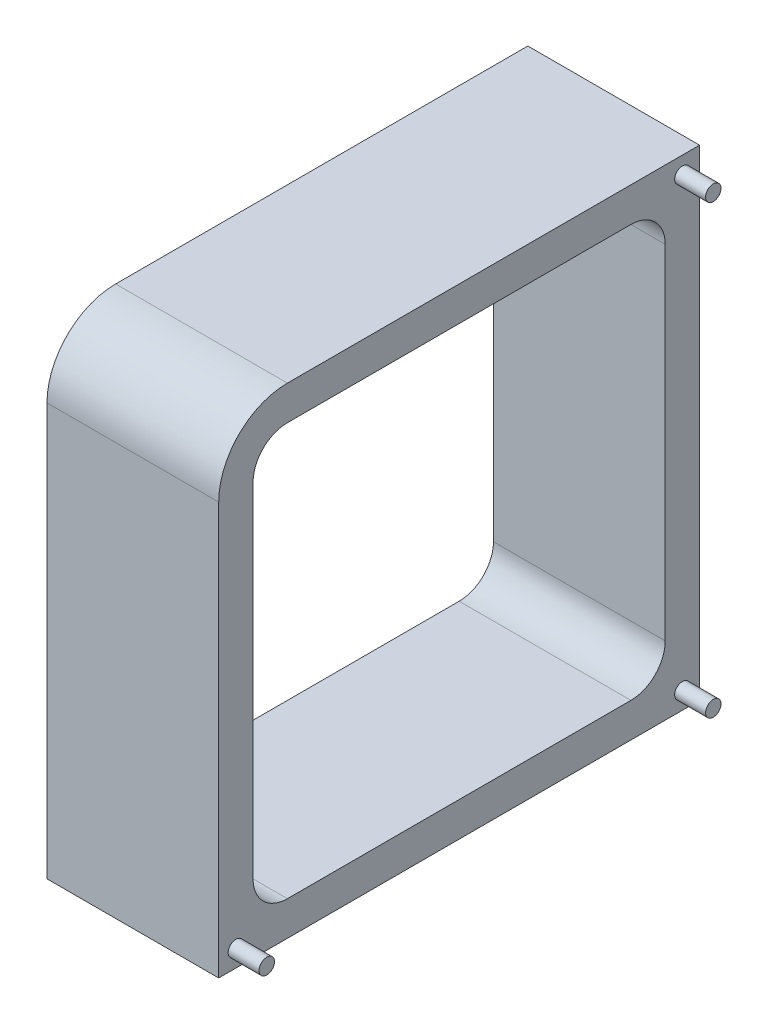
ISO-10303-21;
HEADER;
FILE_DESCRIPTION(('STEP AP214'),'2;1');
FILE_NAME('part.step','',(''),(''),'','','');
FILE_SCHEMA(('AUTOMOTIVE_DESIGN { 1 0 10303 214 1 1 1 1 }'));
ENDSEC;
DATA;
#1=APPLICATION_CONTEXT('core data for automotive mechanical design processes');
#2=APPLICATION_PROTOCOL_DEFINITION('international standard','automotive_design',2000,#1);
#3=PRODUCT_CONTEXT('',#1,'mechanical');
#4=PRODUCT('Part','Part','',(#3));
#5=PRODUCT_RELATED_PRODUCT_CATEGORY('part','',(#4));
#6=PRODUCT_DEFINITION_FORMATION('','',#4);
#7=PRODUCT_DEFINITION_CONTEXT('part definition',#1,'design');
#8=PRODUCT_DEFINITION('design','',#6,#7);
#9=PRODUCT_DEFINITION_SHAPE('','',#8);
#10=(LENGTH_UNIT() NAMED_UNIT(*) SI_UNIT(.MILLI.,.METRE.));
#11=(NAMED_UNIT(*) PLANE_ANGLE_UNIT() SI_UNIT($,.RADIAN.));
#12=(NAMED_UNIT(*) SI_UNIT($,.STERADIAN.) SOLID_ANGLE_UNIT());
#13=UNCERTAINTY_MEASURE_WITH_UNIT(LENGTH_MEASURE(1.E-05),#10,'distance_accuracy_value','');
#14=(GEOMETRIC_REPRESENTATION_CONTEXT(3) GLOBAL_UNCERTAINTY_ASSIGNED_CONTEXT((#13)) GLOBAL_UNIT_ASSIGNED_CONTEXT((#10,
#11,#12)) REPRESENTATION_CONTEXT('',''));
#15=CARTESIAN_POINT('',(0.,0.,0.));
#16=DIRECTION('',(0.,0.,1.));
#17=DIRECTION('',(1.,0.,0.));
#18=AXIS2_PLACEMENT_3D('',#15,#16,#17);
#19=CARTESIAN_POINT('',(50.,120.,-20.));
#20=DIRECTION('',(-1.,0.,0.));
#21=DIRECTION('',(0.,0.,1.));
#22=AXIS2_PLACEMENT_3D('',#19,#20,#21);
#23=PLANE('',#22);
#24=CARTESIAN_POINT('',(50.,135.,-135.));
#25=DIRECTION('',(-1.,0.,0.));
#26=DIRECTION('',(0.,0.,1.));
#27=AXIS2_PLACEMENT_3D('',#24,#25,#26);
#28=CIRCLE('',#27,2.25000000000001);
#29=CARTESIAN_POINT('',(50.,135.,-132.75));
#30=VERTEX_POINT('',#29);
#31=EDGE_CURVE('E11',#30,#30,#28,.F.);
#32=ORIENTED_EDGE('',*,*,#31,.F.);
#33=EDGE_LOOP('',(#32));
#34=FACE_BOUND('',#33,.T.);
#35=CARTESIAN_POINT('',(50.,5.,-135.));
#36=DIRECTION('',(-1.,0.,0.));
#37=DIRECTION('',(0.,0.,1.));
#38=AXIS2_PLACEMENT_3D('',#35,#36,#37);
#39=CIRCLE('',#38,2.25000000000001);
#40=CARTESIAN_POINT('',(50.,5.,-132.75));
#41=VERTEX_POINT('',#40);
#42=EDGE_CURVE('E48',#41,#41,#39,.F.);
#43=ORIENTED_EDGE('',*,*,#42,.F.);
#44=EDGE_LOOP('',(#43));
#45=FACE_BOUND('',#44,.T.);
#46=CARTESIAN_POINT('',(50.,5.,-5.));
#47=DIRECTION('',(-1.,0.,0.));
#48=DIRECTION('',(0.,0.,1.));
#49=AXIS2_PLACEMENT_3D('',#46,#47,#48);
#50=CIRCLE('',#49,2.25);
#51=CARTESIAN_POINT('',(50.,5.,-2.75));
#52=VERTEX_POINT('',#51);
#53=EDGE_CURVE('E277',#52,#52,#50,.F.);
#54=ORIENTED_EDGE('',*,*,#53,.F.);
#55=EDGE_LOOP('',(#54));
#56=FACE_BOUND('',#55,.T.);
#57=DIRECTION('',(0.,-1.,0.));
#58=VECTOR('',#57,1.);
#59=CARTESIAN_POINT('',(50.,0.,0.));
#60=LINE('',#59,#58);
#61=CARTESIAN_POINT('',(50.,120.,0.));
#62=VERTEX_POINT('',#61);
#63=CARTESIAN_POINT('',(50.,0.,0.));
#64=VERTEX_POINT('',#63);
#65=EDGE_CURVE('E226',#62,#64,#60,.T.);
#66=ORIENTED_EDGE('',*,*,#65,.T.);
#67=DIRECTION('',(0.,0.,-1.));
#68=VECTOR('',#67,1.);
#69=CARTESIAN_POINT('',(50.,0.,0.));
#70=LINE('',#69,#68);
#71=CARTESIAN_POINT('',(50.,0.,-140.));
#72=VERTEX_POINT('',#71);
#73=EDGE_CURVE('E230',#64,#72,#70,.T.);
#74=ORIENTED_EDGE('',*,*,#73,.T.);
#75=DIRECTION('',(0.,1.,0.));
#76=VECTOR('',#75,1.);
#77=CARTESIAN_POINT('',(50.,0.,-140.));
#78=LINE('',#77,#76);
#79=CARTESIAN_POINT('',(50.,140.,-140.));
#80=VERTEX_POINT('',#79);
#81=EDGE_CURVE('E234',#72,#80,#78,.T.);
#82=ORIENTED_EDGE('',*,*,#81,.T.);
#83=DIRECTION('',(0.,0.,1.));
#84=VECTOR('',#83,1.);
#85=CARTESIAN_POINT('',(50.,140.,-20.0000000000001));
#86=LINE('',#85,#84);
#87=CARTESIAN_POINT('',(50.,140.,-20.0000000000001));
#88=VERTEX_POINT('',#87);
#89=EDGE_CURVE('E237',#80,#88,#86,.T.);
#90=ORIENTED_EDGE('',*,*,#89,.T.);
#91=CARTESIAN_POINT('',(50.,120.,-20.));
#92=DIRECTION('',(1.,0.,0.));
#93=DIRECTION('',(0.,0.,1.));
#94=AXIS2_PLACEMENT_3D('',#91,#92,#93);
#95=CIRCLE('',#94,20.);
#96=EDGE_CURVE('E240',#88,#62,#95,.T.);
#97=ORIENTED_EDGE('',*,*,#96,.T.);
#98=EDGE_LOOP('',(#66,#74,#82,#90,#97));
#99=FACE_BOUND('',#98,.T.);
#100=CARTESIAN_POINT('',(50.,120.,-120.));
#101=DIRECTION('',(1.,0.,0.));
#102=DIRECTION('',(0.,0.,-1.));
#103=AXIS2_PLACEMENT_3D('',#100,#101,#102);
#104=CIRCLE('',#103,9.99999999999999);
#105=CARTESIAN_POINT('',(50.,120.,-130.));
#106=VERTEX_POINT('',#105);
#107=CARTESIAN_POINT('',(50.,130.,-120.));
#108=VERTEX_POINT('',#107);
#109=EDGE_CURVE('E135',#106,#108,#104,.T.);
#110=ORIENTED_EDGE('',*,*,#109,.F.);
#111=DIRECTION('',(0.,1.,0.));
#112=VECTOR('',#111,1.);
#113=CARTESIAN_POINT('',(50.,20.0000000000001,-130.));
#114=LINE('',#113,#112);
#115=CARTESIAN_POINT('',(50.,20.0000000000001,-130.));
#116=VERTEX_POINT('',#115);
#117=EDGE_CURVE('E177',#116,#106,#114,.T.);
#118=ORIENTED_EDGE('',*,*,#117,.F.);
#119=CARTESIAN_POINT('',(50.,20.,-120.));
#120=DIRECTION('',(1.,0.,0.));
#121=DIRECTION('',(0.,0.,-1.));
#122=AXIS2_PLACEMENT_3D('',#119,#120,#121);
#123=CIRCLE('',#122,9.99999999999999);
#124=CARTESIAN_POINT('',(50.,10.,-120.));
#125=VERTEX_POINT('',#124);
#126=EDGE_CURVE('E174',#125,#116,#123,.T.);
#127=ORIENTED_EDGE('',*,*,#126,.F.);
#128=DIRECTION('',(0.,0.,-1.));
#129=VECTOR('',#128,1.);
#130=CARTESIAN_POINT('',(50.,10.,-20.0000000000001));
#131=LINE('',#130,#129);
#132=CARTESIAN_POINT('',(50.,10.,-20.0000000000001));
#133=VERTEX_POINT('',#132);
#134=EDGE_CURVE('E171',#133,#125,#131,.T.);
#135=ORIENTED_EDGE('',*,*,#134,.F.);
#136=CARTESIAN_POINT('',(50.,20.,-20.));
#137=DIRECTION('',(1.,0.,0.));
#138=DIRECTION('',(0.,0.,-1.));
#139=AXIS2_PLACEMENT_3D('',#136,#137,#138);
#140=CIRCLE('',#139,10.);
#141=CARTESIAN_POINT('',(50.,20.0000000000001,-10.));
#142=VERTEX_POINT('',#141);
#143=EDGE_CURVE('E168',#142,#133,#140,.T.);
#144=ORIENTED_EDGE('',*,*,#143,.F.);
#145=DIRECTION('',(0.,-1.,0.));
#146=VECTOR('',#145,1.);
#147=CARTESIAN_POINT('',(50.,20.0000000000001,-10.));
#148=LINE('',#147,#146);
#149=CARTESIAN_POINT('',(50.,120.,-10.));
#150=VERTEX_POINT('',#149);
#151=EDGE_CURVE('E162',#150,#142,#148,.T.);
#152=ORIENTED_EDGE('',*,*,#151,.F.);
#153=CARTESIAN_POINT('',(50.,120.,-20.));
#154=DIRECTION('',(1.,0.,0.));
#155=DIRECTION('',(0.,0.,1.));
#156=AXIS2_PLACEMENT_3D('',#153,#154,#155);
#157=CIRCLE('',#156,10.);
#158=CARTESIAN_POINT('',(50.,130.,-20.0000000000001));
#159=VERTEX_POINT('',#158);
#160=EDGE_CURVE('E158',#159,#150,#157,.T.);
#161=ORIENTED_EDGE('',*,*,#160,.F.);
#162=DIRECTION('',(0.,0.,1.));
#163=VECTOR('',#162,1.);
#164=CARTESIAN_POINT('',(50.,130.,-20.0000000000001));
#165=LINE('',#164,#163);
#166=EDGE_CURVE('E144',#108,#159,#165,.T.);
#167=ORIENTED_EDGE('',*,*,#166,.F.);
#168=EDGE_LOOP('',(#110,#118,#127,#135,#144,#152,#161,#167));
#169=FACE_BOUND('',#168,.T.);
#170=ADVANCED_FACE('F39',(#34,#45,#56,#99,#169),#23,.F.);
#171=CARTESIAN_POINT('',(0.,120.,-20.));
#172=DIRECTION('',(-1.,0.,0.));
#173=DIRECTION('',(0.,0.,1.));
#174=AXIS2_PLACEMENT_3D('',#171,#172,#173);
#175=PLANE('',#174);
#176=DIRECTION('',(0.,-1.,0.));
#177=VECTOR('',#176,1.);
#178=CARTESIAN_POINT('',(0.,0.,0.));
#179=LINE('',#178,#177);
#180=CARTESIAN_POINT('',(0.,120.,0.));
#181=VERTEX_POINT('',#180);
#182=CARTESIAN_POINT('',(0.,0.,0.));
#183=VERTEX_POINT('',#182);
#184=EDGE_CURVE('E153',#181,#183,#179,.T.);
#185=ORIENTED_EDGE('',*,*,#184,.F.);
#186=CARTESIAN_POINT('',(0.,120.,-20.));
#187=DIRECTION('',(1.,0.,0.));
#188=DIRECTION('',(0.,0.,1.));
#189=AXIS2_PLACEMENT_3D('',#186,#187,#188);
#190=CIRCLE('',#189,20.);
#191=CARTESIAN_POINT('',(0.,140.,-20.0000000000001));
#192=VERTEX_POINT('',#191);
#193=EDGE_CURVE('E231',#192,#181,#190,.T.);
#194=ORIENTED_EDGE('',*,*,#193,.F.);
#195=DIRECTION('',(0.,0.,1.));
#196=VECTOR('',#195,1.);
#197=CARTESIAN_POINT('',(0.,140.,-20.0000000000001));
#198=LINE('',#197,#196);
#199=CARTESIAN_POINT('',(0.,140.,-140.));
#200=VERTEX_POINT('',#199);
#201=EDGE_CURVE('E253',#200,#192,#198,.T.);
#202=ORIENTED_EDGE('',*,*,#201,.F.);
#203=DIRECTION('',(0.,1.,0.));
#204=VECTOR('',#203,1.);
#205=CARTESIAN_POINT('',(0.,0.,-140.));
#206=LINE('',#205,#204);
#207=CARTESIAN_POINT('',(0.,0.,-140.));
#208=VERTEX_POINT('',#207);
#209=EDGE_CURVE('E250',#208,#200,#206,.T.);
#210=ORIENTED_EDGE('',*,*,#209,.F.);
#211=DIRECTION('',(0.,0.,-1.));
#212=VECTOR('',#211,1.);
#213=CARTESIAN_POINT('',(0.,0.,0.));
#214=LINE('',#213,#212);
#215=EDGE_CURVE('E247',#183,#208,#214,.T.);
#216=ORIENTED_EDGE('',*,*,#215,.F.);
#217=EDGE_LOOP('',(#185,#194,#202,#210,#216));
#218=FACE_BOUND('',#217,.T.);
#219=DIRECTION('',(0.,1.,0.));
#220=VECTOR('',#219,1.);
#221=CARTESIAN_POINT('',(0.,20.0000000000001,-130.));
#222=LINE('',#221,#220);
#223=CARTESIAN_POINT('',(0.,20.0000000000001,-130.));
#224=VERTEX_POINT('',#223);
#225=CARTESIAN_POINT('',(0.,120.,-130.));
#226=VERTEX_POINT('',#225);
#227=EDGE_CURVE('E145',#224,#226,#222,.T.);
#228=ORIENTED_EDGE('',*,*,#227,.T.);
#229=CARTESIAN_POINT('',(0.,120.,-120.));
#230=DIRECTION('',(1.,0.,0.));
#231=DIRECTION('',(0.,0.,-1.));
#232=AXIS2_PLACEMENT_3D('',#229,#230,#231);
#233=CIRCLE('',#232,9.99999999999999);
#234=CARTESIAN_POINT('',(0.,130.,-120.));
#235=VERTEX_POINT('',#234);
#236=EDGE_CURVE('E63',#226,#235,#233,.T.);
#237=ORIENTED_EDGE('',*,*,#236,.T.);
#238=DIRECTION('',(0.,0.,1.));
#239=VECTOR('',#238,1.);
#240=CARTESIAN_POINT('',(0.,130.,-20.0000000000001));
#241=LINE('',#240,#239);
#242=CARTESIAN_POINT('',(0.,130.,-20.0000000000001));
#243=VERTEX_POINT('',#242);
#244=EDGE_CURVE('E151',#235,#243,#241,.T.);
#245=ORIENTED_EDGE('',*,*,#244,.T.);
#246=CARTESIAN_POINT('',(0.,120.,-20.));
#247=DIRECTION('',(1.,0.,0.));
#248=DIRECTION('',(0.,0.,1.));
#249=AXIS2_PLACEMENT_3D('',#246,#247,#248);
#250=CIRCLE('',#249,10.);
#251=CARTESIAN_POINT('',(0.,120.,-10.));
#252=VERTEX_POINT('',#251);
#253=EDGE_CURVE('E185',#243,#252,#250,.T.);
#254=ORIENTED_EDGE('',*,*,#253,.T.);
#255=DIRECTION('',(0.,-1.,0.));
#256=VECTOR('',#255,1.);
#257=CARTESIAN_POINT('',(0.,20.0000000000001,-10.));
#258=LINE('',#257,#256);
#259=CARTESIAN_POINT('',(0.,20.0000000000001,-10.));
#260=VERTEX_POINT('',#259);
#261=EDGE_CURVE('E189',#252,#260,#258,.T.);
#262=ORIENTED_EDGE('',*,*,#261,.T.);
#263=CARTESIAN_POINT('',(0.,20.,-20.));
#264=DIRECTION('',(1.,0.,0.));
#265=DIRECTION('',(0.,0.,-1.));
#266=AXIS2_PLACEMENT_3D('',#263,#264,#265);
#267=CIRCLE('',#266,10.);
#268=CARTESIAN_POINT('',(0.,10.,-20.0000000000001));
#269=VERTEX_POINT('',#268);
#270=EDGE_CURVE('E193',#260,#269,#267,.T.);
#271=ORIENTED_EDGE('',*,*,#270,.T.);
#272=DIRECTION('',(0.,0.,-1.));
#273=VECTOR('',#272,1.);
#274=CARTESIAN_POINT('',(0.,10.,-20.0000000000001));
#275=LINE('',#274,#273);
#276=CARTESIAN_POINT('',(0.,10.,-120.));
#277=VERTEX_POINT('',#276);
#278=EDGE_CURVE('E197',#269,#277,#275,.T.);
#279=ORIENTED_EDGE('',*,*,#278,.T.);
#280=CARTESIAN_POINT('',(0.,20.,-120.));
#281=DIRECTION('',(1.,0.,0.));
#282=DIRECTION('',(0.,0.,-1.));
#283=AXIS2_PLACEMENT_3D('',#280,#281,#282);
#284=CIRCLE('',#283,9.99999999999999);
#285=EDGE_CURVE('E201',#277,#224,#284,.T.);
#286=ORIENTED_EDGE('',*,*,#285,.T.);
#287=EDGE_LOOP('',(#228,#237,#245,#254,#262,#271,#279,#286));
#288=FACE_BOUND('',#287,.T.);
#289=ADVANCED_FACE('F288',(#218,#288),#175,.T.);
#290=CARTESIAN_POINT('',(50.,0.,0.));
#291=DIRECTION('',(0.,0.,-1.));
#292=DIRECTION('',(-1.,0.,0.));
#293=AXIS2_PLACEMENT_3D('',#290,#291,#292);
#294=PLANE('',#293);
#295=ORIENTED_EDGE('',*,*,#184,.T.);
#296=DIRECTION('',(-1.,0.,0.));
#297=VECTOR('',#296,1.);
#298=CARTESIAN_POINT('',(50.,0.,0.));
#299=LINE('',#298,#297);
#300=EDGE_CURVE('E273',#64,#183,#299,.T.);
#301=ORIENTED_EDGE('',*,*,#300,.F.);
#302=ORIENTED_EDGE('',*,*,#65,.F.);
#303=DIRECTION('',(-1.,0.,0.));
#304=VECTOR('',#303,1.);
#305=CARTESIAN_POINT('',(50.,120.,0.));
#306=LINE('',#305,#304);
#307=EDGE_CURVE('E243',#62,#181,#306,.T.);
#308=ORIENTED_EDGE('',*,*,#307,.T.);
#309=EDGE_LOOP('',(#295,#301,#302,#308));
#310=FACE_BOUND('',#309,.T.);
#311=ADVANCED_FACE('F41',(#310),#294,.F.);
#312=CARTESIAN_POINT('',(50.,0.,0.));
#313=DIRECTION('',(0.,1.,0.));
#314=DIRECTION('',(0.,0.,1.));
#315=AXIS2_PLACEMENT_3D('',#312,#313,#314);
#316=PLANE('',#315);
#317=ORIENTED_EDGE('',*,*,#215,.T.);
#318=DIRECTION('',(-1.,0.,0.));
#319=VECTOR('',#318,1.);
#320=CARTESIAN_POINT('',(50.,0.,-140.));
#321=LINE('',#320,#319);
#322=EDGE_CURVE('E269',#72,#208,#321,.T.);
#323=ORIENTED_EDGE('',*,*,#322,.F.);
#324=ORIENTED_EDGE('',*,*,#73,.F.);
#325=ORIENTED_EDGE('',*,*,#300,.T.);
#326=EDGE_LOOP('',(#317,#323,#324,#325));
#327=FACE_BOUND('',#326,.T.);
#328=ADVANCED_FACE('F301',(#327),#316,.F.);
#329=CARTESIAN_POINT('',(50.,0.,-140.));
#330=DIRECTION('',(0.,0.,1.));
#331=DIRECTION('',(1.,0.,0.));
#332=AXIS2_PLACEMENT_3D('',#329,#330,#331);
#333=PLANE('',#332);
#334=ORIENTED_EDGE('',*,*,#209,.T.);
#335=DIRECTION('',(-1.,0.,0.));
#336=VECTOR('',#335,1.);
#337=CARTESIAN_POINT('',(50.,140.,-140.));
#338=LINE('',#337,#336);
#339=EDGE_CURVE('E265',#80,#200,#338,.T.);
#340=ORIENTED_EDGE('',*,*,#339,.F.);
#341=ORIENTED_EDGE('',*,*,#81,.F.);
#342=ORIENTED_EDGE('',*,*,#322,.T.);
#343=EDGE_LOOP('',(#334,#340,#341,#342));
#344=FACE_BOUND('',#343,.T.);
#345=ADVANCED_FACE('F306',(#344),#333,.F.);
#346=CARTESIAN_POINT('',(50.,140.,-20.0000000000001));
#347=DIRECTION('',(0.,-1.,0.));
#348=DIRECTION('',(0.,0.,-1.));
#349=AXIS2_PLACEMENT_3D('',#346,#347,#348);
#350=PLANE('',#349);
#351=ORIENTED_EDGE('',*,*,#201,.T.);
#352=DIRECTION('',(-1.,0.,0.));
#353=VECTOR('',#352,1.);
#354=CARTESIAN_POINT('',(50.,140.,-20.0000000000001));
#355=LINE('',#354,#353);
#356=EDGE_CURVE('E261',#88,#192,#355,.T.);
#357=ORIENTED_EDGE('',*,*,#356,.F.);
#358=ORIENTED_EDGE('',*,*,#89,.F.);
#359=ORIENTED_EDGE('',*,*,#339,.T.);
#360=EDGE_LOOP('',(#351,#357,#358,#359));
#361=FACE_BOUND('',#360,.T.);
#362=ADVANCED_FACE('F310',(#361),#350,.F.);
#363=CARTESIAN_POINT('',(50.,120.,-20.));
#364=DIRECTION('',(-1.,0.,0.));
#365=DIRECTION('',(0.,0.,1.));
#366=AXIS2_PLACEMENT_3D('',#363,#364,#365);
#367=CYLINDRICAL_SURFACE('',#366,20.);
#368=ORIENTED_EDGE('',*,*,#193,.T.);
#369=ORIENTED_EDGE('',*,*,#307,.F.);
#370=ORIENTED_EDGE('',*,*,#96,.F.);
#371=ORIENTED_EDGE('',*,*,#356,.T.);
#372=EDGE_LOOP('',(#368,#369,#370,#371));
#373=FACE_BOUND('',#372,.T.);
#374=ADVANCED_FACE('F314',(#373),#367,.T.);
#375=CARTESIAN_POINT('',(50.,120.,-120.));
#376=DIRECTION('',(-1.,0.,0.));
#377=DIRECTION('',(0.,0.,1.));
#378=AXIS2_PLACEMENT_3D('',#375,#376,#377);
#379=CYLINDRICAL_SURFACE('',#378,9.99999999999999);
#380=ORIENTED_EDGE('',*,*,#236,.F.);
#381=DIRECTION('',(-1.,0.,0.));
#382=VECTOR('',#381,1.);
#383=CARTESIAN_POINT('',(50.,120.,-130.));
#384=LINE('',#383,#382);
#385=EDGE_CURVE('E139',#106,#226,#384,.T.);
#386=ORIENTED_EDGE('',*,*,#385,.F.);
#387=ORIENTED_EDGE('',*,*,#109,.T.);
#388=DIRECTION('',(-1.,0.,0.));
#389=VECTOR('',#388,1.);
#390=CARTESIAN_POINT('',(50.,130.,-120.));
#391=LINE('',#390,#389);
#392=EDGE_CURVE('E138',#108,#235,#391,.T.);
#393=ORIENTED_EDGE('',*,*,#392,.T.);
#394=EDGE_LOOP('',(#380,#386,#387,#393));
#395=FACE_BOUND('',#394,.T.);
#396=ADVANCED_FACE('F137',(#395),#379,.F.);
#397=CARTESIAN_POINT('',(50.,130.,-20.0000000000001));
#398=DIRECTION('',(0.,-1.,0.));
#399=DIRECTION('',(0.,0.,-1.));
#400=AXIS2_PLACEMENT_3D('',#397,#398,#399);
#401=PLANE('',#400);
#402=ORIENTED_EDGE('',*,*,#244,.F.);
#403=ORIENTED_EDGE('',*,*,#392,.F.);
#404=ORIENTED_EDGE('',*,*,#166,.T.);
#405=DIRECTION('',(-1.,0.,0.));
#406=VECTOR('',#405,1.);
#407=CARTESIAN_POINT('',(50.,130.,-20.0000000000001));
#408=LINE('',#407,#406);
#409=EDGE_CURVE('E154',#159,#243,#408,.T.);
#410=ORIENTED_EDGE('',*,*,#409,.T.);
#411=EDGE_LOOP('',(#402,#403,#404,#410));
#412=FACE_BOUND('',#411,.T.);
#413=ADVANCED_FACE('F148',(#412),#401,.T.);
#414=CARTESIAN_POINT('',(50.,120.,-20.));
#415=DIRECTION('',(-1.,0.,0.));
#416=DIRECTION('',(0.,0.,1.));
#417=AXIS2_PLACEMENT_3D('',#414,#415,#416);
#418=CYLINDRICAL_SURFACE('',#417,10.);
#419=ORIENTED_EDGE('',*,*,#253,.F.);
#420=ORIENTED_EDGE('',*,*,#409,.F.);
#421=ORIENTED_EDGE('',*,*,#160,.T.);
#422=DIRECTION('',(-1.,0.,0.));
#423=VECTOR('',#422,1.);
#424=CARTESIAN_POINT('',(50.,120.,-10.));
#425=LINE('',#424,#423);
#426=EDGE_CURVE('E221',#150,#252,#425,.T.);
#427=ORIENTED_EDGE('',*,*,#426,.T.);
#428=EDGE_LOOP('',(#419,#420,#421,#427));
#429=FACE_BOUND('',#428,.T.);
#430=ADVANCED_FACE('F341',(#429),#418,.F.);
#431=CARTESIAN_POINT('',(50.,20.0000000000001,-10.));
#432=DIRECTION('',(0.,0.,-1.));
#433=DIRECTION('',(-1.,0.,0.));
#434=AXIS2_PLACEMENT_3D('',#431,#432,#433);
#435=PLANE('',#434);
#436=ORIENTED_EDGE('',*,*,#261,.F.);
#437=ORIENTED_EDGE('',*,*,#426,.F.);
#438=ORIENTED_EDGE('',*,*,#151,.T.);
#439=DIRECTION('',(-1.,0.,0.));
#440=VECTOR('',#439,1.);
#441=CARTESIAN_POINT('',(50.,20.0000000000001,-10.));
#442=LINE('',#441,#440);
#443=EDGE_CURVE('E218',#142,#260,#442,.T.);
#444=ORIENTED_EDGE('',*,*,#443,.T.);
#445=EDGE_LOOP('',(#436,#437,#438,#444));
#446=FACE_BOUND('',#445,.T.);
#447=ADVANCED_FACE('F338',(#446),#435,.T.);
#448=CARTESIAN_POINT('',(50.,20.,-20.));
#449=DIRECTION('',(-1.,0.,0.));
#450=DIRECTION('',(0.,0.,1.));
#451=AXIS2_PLACEMENT_3D('',#448,#449,#450);
#452=CYLINDRICAL_SURFACE('',#451,10.);
#453=ORIENTED_EDGE('',*,*,#270,.F.);
#454=ORIENTED_EDGE('',*,*,#443,.F.);
#455=ORIENTED_EDGE('',*,*,#143,.T.);
#456=DIRECTION('',(-1.,0.,0.));
#457=VECTOR('',#456,1.);
#458=CARTESIAN_POINT('',(50.,10.,-20.0000000000001));
#459=LINE('',#458,#457);
#460=EDGE_CURVE('E215',#133,#269,#459,.T.);
#461=ORIENTED_EDGE('',*,*,#460,.T.);
#462=EDGE_LOOP('',(#453,#454,#455,#461));
#463=FACE_BOUND('',#462,.T.);
#464=ADVANCED_FACE('F333',(#463),#452,.F.);
#465=CARTESIAN_POINT('',(50.,10.,-20.0000000000001));
#466=DIRECTION('',(0.,1.,0.));
#467=DIRECTION('',(0.,0.,1.));
#468=AXIS2_PLACEMENT_3D('',#465,#466,#467);
#469=PLANE('',#468);
#470=ORIENTED_EDGE('',*,*,#278,.F.);
#471=ORIENTED_EDGE('',*,*,#460,.F.);
#472=ORIENTED_EDGE('',*,*,#134,.T.);
#473=DIRECTION('',(-1.,0.,0.));
#474=VECTOR('',#473,1.);
#475=CARTESIAN_POINT('',(50.,10.,-120.));
#476=LINE('',#475,#474);
#477=EDGE_CURVE('E212',#125,#277,#476,.T.);
#478=ORIENTED_EDGE('',*,*,#477,.T.);
#479=EDGE_LOOP('',(#470,#471,#472,#478));
#480=FACE_BOUND('',#479,.T.);
#481=ADVANCED_FACE('F329',(#480),#469,.T.);
#482=CARTESIAN_POINT('',(50.,20.,-120.));
#483=DIRECTION('',(-1.,0.,0.));
#484=DIRECTION('',(0.,0.,1.));
#485=AXIS2_PLACEMENT_3D('',#482,#483,#484);
#486=CYLINDRICAL_SURFACE('',#485,9.99999999999999);
#487=ORIENTED_EDGE('',*,*,#285,.F.);
#488=ORIENTED_EDGE('',*,*,#477,.F.);
#489=ORIENTED_EDGE('',*,*,#126,.T.);
#490=DIRECTION('',(-1.,0.,0.));
#491=VECTOR('',#490,1.);
#492=CARTESIAN_POINT('',(50.,20.0000000000001,-130.));
#493=LINE('',#492,#491);
#494=EDGE_CURVE('E55',#116,#224,#493,.T.);
#495=ORIENTED_EDGE('',*,*,#494,.T.);
#496=EDGE_LOOP('',(#487,#488,#489,#495));
#497=FACE_BOUND('',#496,.T.);
#498=ADVANCED_FACE('F326',(#497),#486,.F.);
#499=CARTESIAN_POINT('',(50.,20.0000000000001,-130.));
#500=DIRECTION('',(0.,0.,1.));
#501=DIRECTION('',(0.,-1.,0.));
#502=AXIS2_PLACEMENT_3D('',#499,#500,#501);
#503=PLANE('',#502);
#504=ORIENTED_EDGE('',*,*,#227,.F.);
#505=ORIENTED_EDGE('',*,*,#494,.F.);
#506=ORIENTED_EDGE('',*,*,#117,.T.);
#507=ORIENTED_EDGE('',*,*,#385,.T.);
#508=EDGE_LOOP('',(#504,#505,#506,#507));
#509=FACE_BOUND('',#508,.T.);
#510=ADVANCED_FACE('F320',(#509),#503,.T.);
#511=CARTESIAN_POINT('',(59.,5.,-5.));
#512=DIRECTION('',(-1.,0.,0.));
#513=DIRECTION('',(0.,0.,1.));
#514=AXIS2_PLACEMENT_3D('',#511,#512,#513);
#515=CYLINDRICAL_SURFACE('',#514,2.25);
#516=CARTESIAN_POINT('',(59.,5.,-5.));
#517=DIRECTION('',(1.,0.,0.));
#518=DIRECTION('',(0.,0.,-1.));
#519=AXIS2_PLACEMENT_3D('',#516,#517,#518);
#520=CIRCLE('',#519,2.25);
#521=CARTESIAN_POINT('',(59.,5.,-7.25));
#522=VERTEX_POINT('',#521);
#523=EDGE_CURVE('E182',#522,#522,#520,.T.);
#524=ORIENTED_EDGE('',*,*,#523,.F.);
#525=EDGE_LOOP('',(#524));
#526=FACE_BOUND('',#525,.T.);
#527=ORIENTED_EDGE('',*,*,#53,.T.);
#528=EDGE_LOOP('',(#527));
#529=FACE_BOUND('',#528,.T.);
#530=ADVANCED_FACE('F383',(#526,#529),#515,.T.);
#531=CARTESIAN_POINT('',(59.,5.,-5.));
#532=DIRECTION('',(1.,0.,0.));
#533=DIRECTION('',(0.,0.,-1.));
#534=AXIS2_PLACEMENT_3D('',#531,#532,#533);
#535=PLANE('',#534);
#536=ORIENTED_EDGE('',*,*,#523,.T.);
#537=EDGE_LOOP('',(#536));
#538=FACE_BOUND('',#537,.T.);
#539=ADVANCED_FACE('F388',(#538),#535,.T.);
#540=CARTESIAN_POINT('',(59.,5.,-135.));
#541=DIRECTION('',(-1.,0.,0.));
#542=DIRECTION('',(0.,0.,1.));
#543=AXIS2_PLACEMENT_3D('',#540,#541,#542);
#544=CYLINDRICAL_SURFACE('',#543,2.25000000000001);
#545=CARTESIAN_POINT('',(59.,5.,-135.));
#546=DIRECTION('',(1.,0.,0.));
#547=DIRECTION('',(0.,0.,-1.));
#548=AXIS2_PLACEMENT_3D('',#545,#546,#547);
#549=CIRCLE('',#548,2.25000000000001);
#550=CARTESIAN_POINT('',(59.,5.,-137.25));
#551=VERTEX_POINT('',#550);
#552=EDGE_CURVE('E519',#551,#551,#549,.T.);
#553=ORIENTED_EDGE('',*,*,#552,.F.);
#554=EDGE_LOOP('',(#553));
#555=FACE_BOUND('',#554,.T.);
#556=ORIENTED_EDGE('',*,*,#42,.T.);
#557=EDGE_LOOP('',(#556));
#558=FACE_BOUND('',#557,.T.);
#559=ADVANCED_FACE('F284',(#555,#558),#544,.T.);
#560=CARTESIAN_POINT('',(59.,5.,-135.));
#561=DIRECTION('',(1.,0.,0.));
#562=DIRECTION('',(0.,0.,-1.));
#563=AXIS2_PLACEMENT_3D('',#560,#561,#562);
#564=PLANE('',#563);
#565=ORIENTED_EDGE('',*,*,#552,.T.);
#566=EDGE_LOOP('',(#565));
#567=FACE_BOUND('',#566,.T.);
#568=ADVANCED_FACE('F407',(#567),#564,.T.);
#569=CARTESIAN_POINT('',(59.,135.,-135.));
#570=DIRECTION('',(-1.,0.,0.));
#571=DIRECTION('',(0.,0.,1.));
#572=AXIS2_PLACEMENT_3D('',#569,#570,#571);
#573=CYLINDRICAL_SURFACE('',#572,2.25000000000001);
#574=CARTESIAN_POINT('',(59.,135.,-135.));
#575=DIRECTION('',(1.,0.,0.));
#576=DIRECTION('',(0.,0.,-1.));
#577=AXIS2_PLACEMENT_3D('',#574,#575,#576);
#578=CIRCLE('',#577,2.25000000000001);
#579=CARTESIAN_POINT('',(59.,135.,-137.25));
#580=VERTEX_POINT('',#579);
#581=EDGE_CURVE('E517',#580,#580,#578,.T.);
#582=ORIENTED_EDGE('',*,*,#581,.F.);
#583=EDGE_LOOP('',(#582));
#584=FACE_BOUND('',#583,.T.);
#585=ORIENTED_EDGE('',*,*,#31,.T.);
#586=EDGE_LOOP('',(#585));
#587=FACE_BOUND('',#586,.T.);
#588=ADVANCED_FACE('F417',(#584,#587),#573,.T.);
#589=CARTESIAN_POINT('',(59.,135.,-135.));
#590=DIRECTION('',(1.,0.,0.));
#591=DIRECTION('',(0.,0.,-1.));
#592=AXIS2_PLACEMENT_3D('',#589,#590,#591);
#593=PLANE('',#592);
#594=ORIENTED_EDGE('',*,*,#581,.T.);
#595=EDGE_LOOP('',(#594));
#596=FACE_BOUND('',#595,.T.);
#597=ADVANCED_FACE('F427',(#596),#593,.T.);
#598=CLOSED_SHELL('',(#170,#289,#311,#328,#345,#362,#374,#396,#413,#430,#447,#464,#481,#498,
#510,#530,#539,#559,#568,#588,#597));
#599=MANIFOLD_SOLID_BREP('B2',#598);
#600=ADVANCED_BREP_SHAPE_REPRESENTATION('',(#18,#599),#14);
#601=SHAPE_DEFINITION_REPRESENTATION(#9,#600);
ENDSEC;
END-ISO-10303-21;
